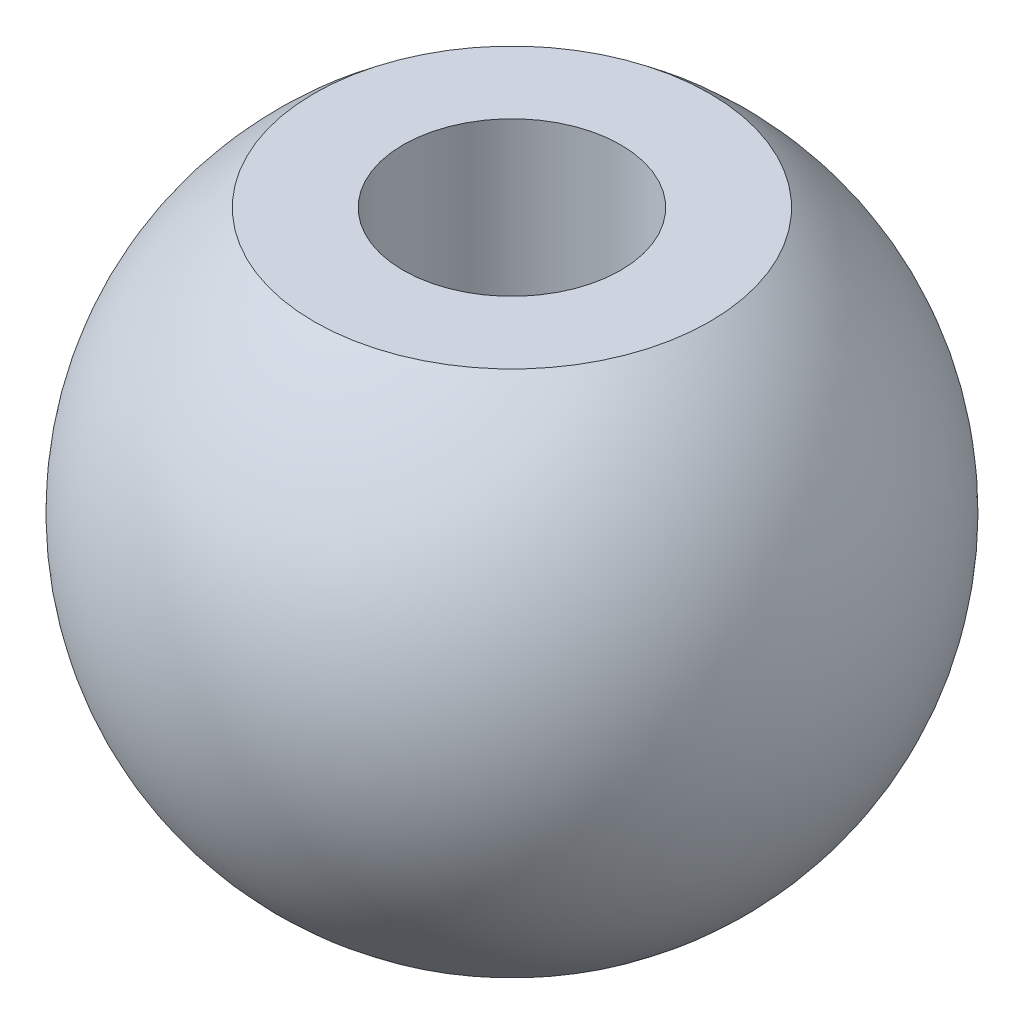
ISO-10303-21;
HEADER;
FILE_DESCRIPTION(('STEP AP214'),'2;1');
FILE_NAME('part.step','',(''),(''),'','','');
FILE_SCHEMA(('AUTOMOTIVE_DESIGN { 1 0 10303 214 1 1 1 1 }'));
ENDSEC;
DATA;
#1=APPLICATION_CONTEXT('core data for automotive mechanical design processes');
#2=APPLICATION_PROTOCOL_DEFINITION('international standard','automotive_design',2000,#1);
#3=PRODUCT_CONTEXT('',#1,'mechanical');
#4=PRODUCT('Part','Part','',(#3));
#5=PRODUCT_RELATED_PRODUCT_CATEGORY('part','',(#4));
#6=PRODUCT_DEFINITION_FORMATION('','',#4);
#7=PRODUCT_DEFINITION_CONTEXT('part definition',#1,'design');
#8=PRODUCT_DEFINITION('design','',#6,#7);
#9=PRODUCT_DEFINITION_SHAPE('','',#8);
#10=(LENGTH_UNIT() NAMED_UNIT(*) SI_UNIT(.MILLI.,.METRE.));
#11=(NAMED_UNIT(*) PLANE_ANGLE_UNIT() SI_UNIT($,.RADIAN.));
#12=(NAMED_UNIT(*) SI_UNIT($,.STERADIAN.) SOLID_ANGLE_UNIT());
#13=UNCERTAINTY_MEASURE_WITH_UNIT(LENGTH_MEASURE(1.E-05),#10,'distance_accuracy_value','');
#14=(GEOMETRIC_REPRESENTATION_CONTEXT(3) GLOBAL_UNCERTAINTY_ASSIGNED_CONTEXT((#13)) GLOBAL_UNIT_ASSIGNED_CONTEXT((#10,
#11,#12)) REPRESENTATION_CONTEXT('',''));
#15=CARTESIAN_POINT('',(0.,0.,0.));
#16=DIRECTION('',(0.,0.,1.));
#17=DIRECTION('',(1.,0.,0.));
#18=AXIS2_PLACEMENT_3D('',#15,#16,#17);
#19=CARTESIAN_POINT('',(-27.5,4.,0.));
#20=DIRECTION('',(0.,1.,0.));
#21=DIRECTION('',(-1.,0.,0.));
#22=AXIS2_PLACEMENT_3D('',#19,#20,#21);
#23=SPHERICAL_SURFACE('',#22,5.);
#24=CARTESIAN_POINT('',(-27.5,0.,0.));
#25=DIRECTION('',(0.,1.,0.));
#26=DIRECTION('',(0.,0.,1.));
#27=AXIS2_PLACEMENT_3D('',#24,#25,#26);
#28=CIRCLE('',#27,3.);
#29=CARTESIAN_POINT('',(-30.5,0.,0.));
#30=VERTEX_POINT('',#29);
#31=EDGE_CURVE('E10',#30,#30,#28,.T.);
#32=CARTESIAN_POINT('',(-27.5,8.,0.));
#33=DIRECTION('',(0.,1.,0.));
#34=DIRECTION('',(0.,0.,1.));
#35=AXIS2_PLACEMENT_3D('',#32,#33,#34);
#36=CIRCLE('',#35,3.);
#37=CARTESIAN_POINT('',(-30.5,8.,0.));
#38=VERTEX_POINT('',#37);
#39=EDGE_CURVE('E47',#38,#38,#36,.T.);
#40=CARTESIAN_POINT('',(-30.5,0.,0.));
#41=CARTESIAN_POINT('',(-30.577276775515,0.0579533682934307,0.));
#42=CARTESIAN_POINT('',(-30.6528698608554,0.118151092258722,0.));
#43=CARTESIAN_POINT('',(-30.8004443780825,0.242821788171596,0.));
#44=CARTESIAN_POINT('',(-30.8724258099692,0.307294760119179,0.));
#45=CARTESIAN_POINT('',(-31.0125327471845,0.44030248863521,0.));
#46=CARTESIAN_POINT('',(-31.0806582525131,0.508837245203659,0.));
#47=CARTESIAN_POINT('',(-31.2128252611481,0.649737593621804,0.));
#48=CARTESIAN_POINT('',(-31.2768667644545,0.7221031854715,0.));
#49=CARTESIAN_POINT('',(-31.4006505367308,0.870422422070826,0.));
#50=CARTESIAN_POINT('',(-31.4603928057006,0.946376066820457,0.));
#51=CARTESIAN_POINT('',(-31.5753775469251,1.10161630214762,0.));
#52=CARTESIAN_POINT('',(-31.6306200191798,1.18090289272516,0.));
#53=CARTESIAN_POINT('',(-31.7364196521818,1.3425427947657,0.));
#54=CARTESIAN_POINT('',(-31.7869768129291,1.42489610622871,0.));
#55=CARTESIAN_POINT('',(-31.8832360579273,1.59239290736677,0.));
#56=CARTESIAN_POINT('',(-31.9289381421782,1.67753639704182,0.));
#57=CARTESIAN_POINT('',(-32.0153337678209,1.8503276479586,0.));
#58=CARTESIAN_POINT('',(-32.0560273092127,1.93797540920034,0.));
#59=CARTESIAN_POINT('',(-32.1322692024247,2.11548088595727,0.));
#60=CARTESIAN_POINT('',(-32.1678175542449,2.20533860147248,0.));
#61=CARTESIAN_POINT('',(-32.2336496985794,2.3869622489438,0.));
#62=CARTESIAN_POINT('',(-32.2639334910937,2.47872818089991,0.));
#63=CARTESIAN_POINT('',(-32.3191348253072,2.6638601156187,0.));
#64=CARTESIAN_POINT('',(-32.3440523670064,2.75722611838137,0.));
#65=CARTESIAN_POINT('',(-32.3884375276709,2.94524467614502,0.));
#66=CARTESIAN_POINT('',(-32.4079051466361,3.03989723114599,0.));
#67=CARTESIAN_POINT('',(-32.4413250905002,3.23017105462975,0.));
#68=CARTESIAN_POINT('',(-32.455277415399,3.32579232311253,0.));
#69=CARTESIAN_POINT('',(-32.4776199198897,3.5176824819118,0.));
#70=CARTESIAN_POINT('',(-32.4860100994817,3.61395137222829,0.));
#71=CARTESIAN_POINT('',(-32.4972001395368,3.80681350836318,0.));
#72=CARTESIAN_POINT('',(-32.5,3.90340675418159,0.));
#73=CARTESIAN_POINT('',(-32.5,4.09659324581841,0.));
#74=CARTESIAN_POINT('',(-32.4972001395368,4.19318649163681,0.));
#75=CARTESIAN_POINT('',(-32.4860100994817,4.38604862777171,0.));
#76=CARTESIAN_POINT('',(-32.4776199198897,4.4823175180882,0.));
#77=CARTESIAN_POINT('',(-32.455277415399,4.67420767688746,0.));
#78=CARTESIAN_POINT('',(-32.4413250905002,4.76982894537024,0.));
#79=CARTESIAN_POINT('',(-32.4079051466361,4.960102768854,0.));
#80=CARTESIAN_POINT('',(-32.3884375276709,5.05475532385498,0.));
#81=CARTESIAN_POINT('',(-32.3440523670064,5.24277388161863,0.));
#82=CARTESIAN_POINT('',(-32.3191348253072,5.3361398843813,0.));
#83=CARTESIAN_POINT('',(-32.2639334910937,5.52127181910009,0.));
#84=CARTESIAN_POINT('',(-32.2336496985794,5.6130377510562,0.));
#85=CARTESIAN_POINT('',(-32.1678175542449,5.79466139852752,0.));
#86=CARTESIAN_POINT('',(-32.1322692024247,5.88451911404272,0.));
#87=CARTESIAN_POINT('',(-32.0560273092127,6.06202459079966,0.));
#88=CARTESIAN_POINT('',(-32.0153337678209,6.14967235204139,0.));
#89=CARTESIAN_POINT('',(-31.9289381421782,6.32246360295818,0.));
#90=CARTESIAN_POINT('',(-31.8832360579273,6.40760709263323,0.));
#91=CARTESIAN_POINT('',(-31.7869768129291,6.57510389377129,0.));
#92=CARTESIAN_POINT('',(-31.7364196521818,6.6574572052343,0.));
#93=CARTESIAN_POINT('',(-31.6306200191798,6.81909710727484,0.));
#94=CARTESIAN_POINT('',(-31.5753775469251,6.89838369785238,0.));
#95=CARTESIAN_POINT('',(-31.4603928057006,7.05362393317954,0.));
#96=CARTESIAN_POINT('',(-31.4006505367308,7.12957757792917,0.));
#97=CARTESIAN_POINT('',(-31.2768667644545,7.2778968145285,0.));
#98=CARTESIAN_POINT('',(-31.2128252611481,7.3502624063782,0.));
#99=CARTESIAN_POINT('',(-31.0806582525131,7.49116275479634,0.));
#100=CARTESIAN_POINT('',(-31.0125327471845,7.55969751136479,0.));
#101=CARTESIAN_POINT('',(-30.8724258099692,7.69270523988082,0.));
#102=CARTESIAN_POINT('',(-30.8004443780825,7.7571782118284,0.));
#103=CARTESIAN_POINT('',(-30.6528698608554,7.88184890774128,0.));
#104=CARTESIAN_POINT('',(-30.577276775515,7.94204663170657,0.));
#105=CARTESIAN_POINT('',(-30.5,8.,0.));
#106=B_SPLINE_CURVE_WITH_KNOTS('',3,(#40,#41,#42,#43,#44,#45,#46,#47,#48,#49,#50,#51,#52,#53,
#54,#55,#56,#57,#58,#59,#60,#61,#62,#63,#64,#65,#66,#67,#68,#69,#70,#71,#72,#73,#74,#75,#76,#77,
#78,#79,#80,#81,#82,#83,#84,#85,#86,#87,#88,#89,#90,#91,#92,#93,#94,#95,#96,#97,#98,#99,#100,
#101,#102,#103,#104,#105),.UNSPECIFIED.,.F.,.F.,(4,2,2,2,2,2,2,2,2,2,2,2,2,2,2,2,2,2,2,2,2,2,2,
2,2,2,2,2,2,2,2,2,4),(0.,0.28973920153736,0.57947840307472,0.869217604612078,1.15895680614944,
1.4486960076868,1.73843520922416,2.02817441076152,2.31791361229887,2.60765281383624,
2.89739201537359,3.18713121691095,3.47687041844831,3.76660961998567,4.05634882152303,
4.34608802306039,4.63582722459775,4.92556642613511,5.21530562767247,5.50504482920983,
5.79478403074719,6.08452323228454,6.3742624338219,6.66400163535926,6.95374083689662,
7.24348003843398,7.53321923997134,7.8229584415087,8.11269764304606,8.40243684458342,
8.69217604612078,8.98191524765814,9.27165444919549),.UNSPECIFIED.);
#107=EDGE_CURVE('BSEAM39',#30,#38,#106,.T.);
#108=ORIENTED_EDGE('',*,*,#31,.T.);
#109=ORIENTED_EDGE('',*,*,#39,.F.);
#110=ORIENTED_EDGE('',*,*,#107,.T.);
#111=ORIENTED_EDGE('',*,*,#107,.F.);
#112=EDGE_LOOP('',(#108,#110,#109,#111));
#113=FACE_BOUND('',#112,.T.);
#114=ADVANCED_FACE('F39',(#113),#23,.T.);
#115=CARTESIAN_POINT('',(0.,0.,0.));
#116=DIRECTION('',(0.,1.,0.));
#117=DIRECTION('',(0.,0.,1.));
#118=AXIS2_PLACEMENT_3D('',#115,#116,#117);
#119=PLANE('',#118);
#120=CARTESIAN_POINT('',(-27.5,0.,0.));
#121=DIRECTION('',(0.,-1.,0.));
#122=DIRECTION('',(0.,0.,-1.));
#123=AXIS2_PLACEMENT_3D('',#120,#121,#122);
#124=CIRCLE('',#123,1.65);
#125=CARTESIAN_POINT('',(-27.5,0.,-1.65));
#126=VERTEX_POINT('',#125);
#127=EDGE_CURVE('E53',#126,#126,#124,.T.);
#128=ORIENTED_EDGE('',*,*,#127,.F.);
#129=EDGE_LOOP('',(#128));
#130=FACE_BOUND('',#129,.T.);
#131=ORIENTED_EDGE('',*,*,#31,.F.);
#132=EDGE_LOOP('',(#131));
#133=FACE_BOUND('',#132,.T.);
#134=ADVANCED_FACE('F41',(#130,#133),#119,.F.);
#135=CARTESIAN_POINT('',(0.,8.,0.));
#136=DIRECTION('',(0.,1.,0.));
#137=DIRECTION('',(0.,0.,1.));
#138=AXIS2_PLACEMENT_3D('',#135,#136,#137);
#139=PLANE('',#138);
#140=CARTESIAN_POINT('',(-27.5,8.,0.));
#141=DIRECTION('',(0.,1.,0.));
#142=DIRECTION('',(0.,0.,1.));
#143=AXIS2_PLACEMENT_3D('',#140,#141,#142);
#144=CIRCLE('',#143,1.65);
#145=CARTESIAN_POINT('',(-27.5,8.,1.65));
#146=VERTEX_POINT('',#145);
#147=EDGE_CURVE('E43',#146,#146,#144,.T.);
#148=ORIENTED_EDGE('',*,*,#147,.F.);
#149=EDGE_LOOP('',(#148));
#150=FACE_BOUND('',#149,.T.);
#151=ORIENTED_EDGE('',*,*,#39,.T.);
#152=EDGE_LOOP('',(#151));
#153=FACE_BOUND('',#152,.T.);
#154=ADVANCED_FACE('F62',(#150,#153),#139,.T.);
#155=CARTESIAN_POINT('',(-27.5,10.,0.));
#156=DIRECTION('',(0.,-1.,0.));
#157=DIRECTION('',(0.,0.,-1.));
#158=AXIS2_PLACEMENT_3D('',#155,#156,#157);
#159=CYLINDRICAL_SURFACE('',#158,1.65);
#160=ORIENTED_EDGE('',*,*,#147,.T.);
#161=EDGE_LOOP('',(#160));
#162=FACE_BOUND('',#161,.T.);
#163=ORIENTED_EDGE('',*,*,#127,.T.);
#164=EDGE_LOOP('',(#163));
#165=FACE_BOUND('',#164,.T.);
#166=ADVANCED_FACE('F60',(#162,#165),#159,.F.);
#167=CLOSED_SHELL('',(#114,#134,#154,#166));
#168=MANIFOLD_SOLID_BREP('B2',#167);
#169=ADVANCED_BREP_SHAPE_REPRESENTATION('',(#18,#168),#14);
#170=SHAPE_DEFINITION_REPRESENTATION(#9,#169);
ENDSEC;
END-ISO-10303-21;
